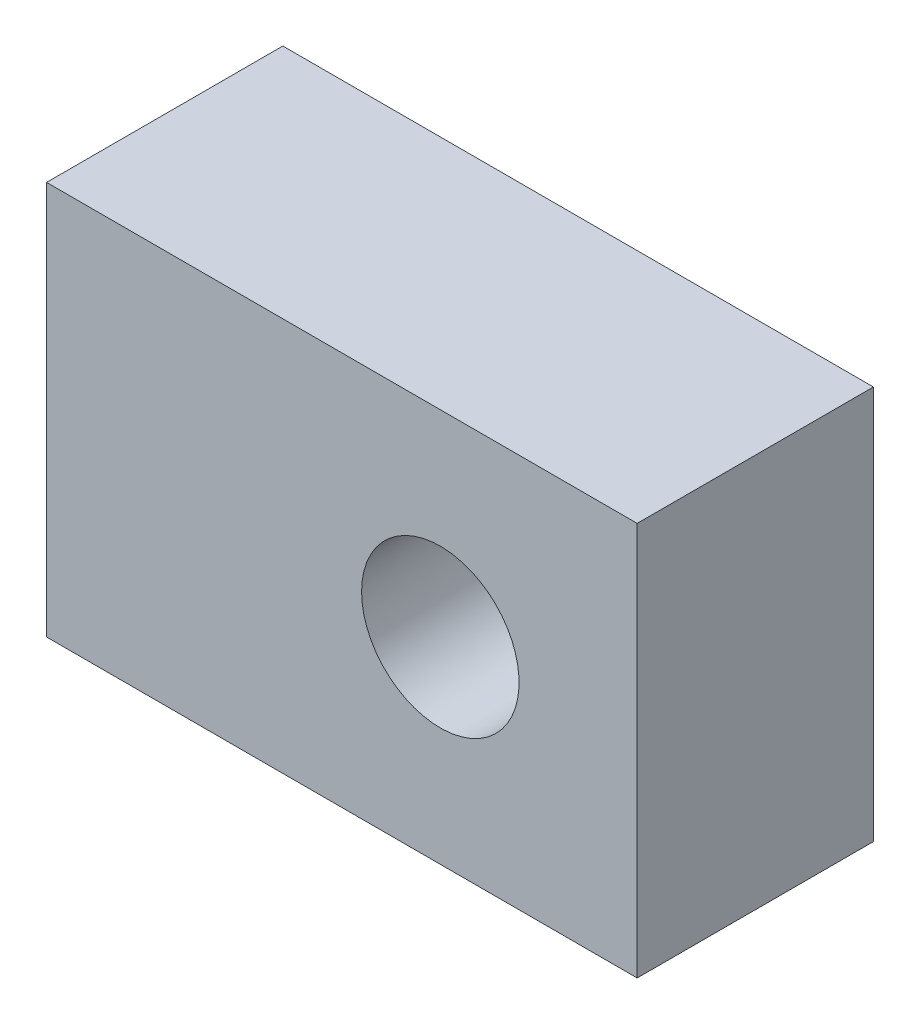
ISO-10303-21;
HEADER;
FILE_DESCRIPTION(('STEP AP214'),'2;1');
FILE_NAME('part.step','',(''),(''),'','','');
FILE_SCHEMA(('AUTOMOTIVE_DESIGN { 1 0 10303 214 1 1 1 1 }'));
ENDSEC;
DATA;
#1=APPLICATION_CONTEXT('core data for automotive mechanical design processes');
#2=APPLICATION_PROTOCOL_DEFINITION('international standard','automotive_design',2000,#1);
#3=PRODUCT_CONTEXT('',#1,'mechanical');
#4=PRODUCT('Part','Part','',(#3));
#5=PRODUCT_RELATED_PRODUCT_CATEGORY('part','',(#4));
#6=PRODUCT_DEFINITION_FORMATION('','',#4);
#7=PRODUCT_DEFINITION_CONTEXT('part definition',#1,'design');
#8=PRODUCT_DEFINITION('design','',#6,#7);
#9=PRODUCT_DEFINITION_SHAPE('','',#8);
#10=(LENGTH_UNIT() NAMED_UNIT(*) SI_UNIT(.MILLI.,.METRE.));
#11=(NAMED_UNIT(*) PLANE_ANGLE_UNIT() SI_UNIT($,.RADIAN.));
#12=(NAMED_UNIT(*) SI_UNIT($,.STERADIAN.) SOLID_ANGLE_UNIT());
#13=UNCERTAINTY_MEASURE_WITH_UNIT(LENGTH_MEASURE(1.E-05),#10,'distance_accuracy_value','');
#14=(GEOMETRIC_REPRESENTATION_CONTEXT(3) GLOBAL_UNCERTAINTY_ASSIGNED_CONTEXT((#13)) GLOBAL_UNIT_ASSIGNED_CONTEXT((#10,
#11,#12)) REPRESENTATION_CONTEXT('',''));
#15=CARTESIAN_POINT('',(0.,0.,0.));
#16=DIRECTION('',(0.,0.,1.));
#17=DIRECTION('',(1.,0.,0.));
#18=AXIS2_PLACEMENT_3D('',#15,#16,#17);
#19=CARTESIAN_POINT('',(0.,0.,6.));
#20=DIRECTION('',(1.,0.,0.));
#21=DIRECTION('',(0.,0.,-1.));
#22=AXIS2_PLACEMENT_3D('',#19,#20,#21);
#23=PLANE('',#22);
#24=DIRECTION('',(0.,-1.,0.));
#25=VECTOR('',#24,1.);
#26=CARTESIAN_POINT('',(0.,0.,0.));
#27=LINE('',#26,#25);
#28=CARTESIAN_POINT('',(0.,10.,0.));
#29=VERTEX_POINT('',#28);
#30=CARTESIAN_POINT('',(0.,0.,0.));
#31=VERTEX_POINT('',#30);
#32=EDGE_CURVE('E106',#29,#31,#27,.T.);
#33=ORIENTED_EDGE('',*,*,#32,.T.);
#34=DIRECTION('',(0.,0.,-1.));
#35=VECTOR('',#34,1.);
#36=CARTESIAN_POINT('',(0.,0.,6.));
#37=LINE('',#36,#35);
#38=CARTESIAN_POINT('',(0.,0.,6.));
#39=VERTEX_POINT('',#38);
#40=EDGE_CURVE('E11',#39,#31,#37,.T.);
#41=ORIENTED_EDGE('',*,*,#40,.F.);
#42=DIRECTION('',(0.,-1.,0.));
#43=VECTOR('',#42,1.);
#44=CARTESIAN_POINT('',(0.,0.,6.));
#45=LINE('',#44,#43);
#46=CARTESIAN_POINT('',(0.,10.,6.));
#47=VERTEX_POINT('',#46);
#48=EDGE_CURVE('E90',#47,#39,#45,.T.);
#49=ORIENTED_EDGE('',*,*,#48,.F.);
#50=DIRECTION('',(0.,0.,-1.));
#51=VECTOR('',#50,1.);
#52=CARTESIAN_POINT('',(0.,10.,6.));
#53=LINE('',#52,#51);
#54=EDGE_CURVE('E102',#47,#29,#53,.T.);
#55=ORIENTED_EDGE('',*,*,#54,.T.);
#56=EDGE_LOOP('',(#33,#41,#49,#55));
#57=FACE_BOUND('',#56,.T.);
#58=ADVANCED_FACE('F38',(#57),#23,.F.);
#59=CARTESIAN_POINT('',(0.,0.,6.));
#60=DIRECTION('',(0.,1.,0.));
#61=DIRECTION('',(0.,0.,1.));
#62=AXIS2_PLACEMENT_3D('',#59,#60,#61);
#63=PLANE('',#62);
#64=DIRECTION('',(1.,0.,0.));
#65=VECTOR('',#64,1.);
#66=CARTESIAN_POINT('',(0.,0.,0.));
#67=LINE('',#66,#65);
#68=CARTESIAN_POINT('',(15.,0.,0.));
#69=VERTEX_POINT('',#68);
#70=EDGE_CURVE('E95',#31,#69,#67,.T.);
#71=ORIENTED_EDGE('',*,*,#70,.T.);
#72=DIRECTION('',(0.,0.,-1.));
#73=VECTOR('',#72,1.);
#74=CARTESIAN_POINT('',(15.,0.,6.));
#75=LINE('',#74,#73);
#76=CARTESIAN_POINT('',(15.,0.,6.));
#77=VERTEX_POINT('',#76);
#78=EDGE_CURVE('E47',#77,#69,#75,.T.);
#79=ORIENTED_EDGE('',*,*,#78,.F.);
#80=DIRECTION('',(1.,0.,0.));
#81=VECTOR('',#80,1.);
#82=CARTESIAN_POINT('',(0.,0.,6.));
#83=LINE('',#82,#81);
#84=EDGE_CURVE('E85',#39,#77,#83,.T.);
#85=ORIENTED_EDGE('',*,*,#84,.F.);
#86=ORIENTED_EDGE('',*,*,#40,.T.);
#87=EDGE_LOOP('',(#71,#79,#85,#86));
#88=FACE_BOUND('',#87,.T.);
#89=ADVANCED_FACE('F94',(#88),#63,.F.);
#90=CARTESIAN_POINT('',(15.,0.,6.));
#91=DIRECTION('',(-1.,0.,0.));
#92=DIRECTION('',(0.,0.,1.));
#93=AXIS2_PLACEMENT_3D('',#90,#91,#92);
#94=PLANE('',#93);
#95=DIRECTION('',(0.,1.,0.));
#96=VECTOR('',#95,1.);
#97=CARTESIAN_POINT('',(15.,0.,0.));
#98=LINE('',#97,#96);
#99=CARTESIAN_POINT('',(15.,10.,0.));
#100=VERTEX_POINT('',#99);
#101=EDGE_CURVE('E72',#69,#100,#98,.T.);
#102=ORIENTED_EDGE('',*,*,#101,.T.);
#103=DIRECTION('',(0.,0.,-1.));
#104=VECTOR('',#103,1.);
#105=CARTESIAN_POINT('',(15.,10.,6.));
#106=LINE('',#105,#104);
#107=CARTESIAN_POINT('',(15.,10.,6.));
#108=VERTEX_POINT('',#107);
#109=EDGE_CURVE('E97',#108,#100,#106,.T.);
#110=ORIENTED_EDGE('',*,*,#109,.F.);
#111=DIRECTION('',(0.,1.,0.));
#112=VECTOR('',#111,1.);
#113=CARTESIAN_POINT('',(15.,0.,6.));
#114=LINE('',#113,#112);
#115=EDGE_CURVE('E88',#77,#108,#114,.T.);
#116=ORIENTED_EDGE('',*,*,#115,.F.);
#117=ORIENTED_EDGE('',*,*,#78,.T.);
#118=EDGE_LOOP('',(#102,#110,#116,#117));
#119=FACE_BOUND('',#118,.T.);
#120=ADVANCED_FACE('F98',(#119),#94,.F.);
#121=CARTESIAN_POINT('',(0.,10.,6.));
#122=DIRECTION('',(0.,-1.,0.));
#123=DIRECTION('',(0.,0.,-1.));
#124=AXIS2_PLACEMENT_3D('',#121,#122,#123);
#125=PLANE('',#124);
#126=DIRECTION('',(-1.,0.,0.));
#127=VECTOR('',#126,1.);
#128=CARTESIAN_POINT('',(0.,10.,0.));
#129=LINE('',#128,#127);
#130=EDGE_CURVE('E78',#100,#29,#129,.T.);
#131=ORIENTED_EDGE('',*,*,#130,.T.);
#132=ORIENTED_EDGE('',*,*,#54,.F.);
#133=DIRECTION('',(-1.,0.,0.));
#134=VECTOR('',#133,1.);
#135=CARTESIAN_POINT('',(0.,10.,6.));
#136=LINE('',#135,#134);
#137=EDGE_CURVE('E55',#108,#47,#136,.T.);
#138=ORIENTED_EDGE('',*,*,#137,.F.);
#139=ORIENTED_EDGE('',*,*,#109,.T.);
#140=EDGE_LOOP('',(#131,#132,#138,#139));
#141=FACE_BOUND('',#140,.T.);
#142=ADVANCED_FACE('F120',(#141),#125,.F.);
#143=CARTESIAN_POINT('',(0.,0.,6.));
#144=DIRECTION('',(0.,0.,-1.));
#145=DIRECTION('',(-1.,0.,0.));
#146=AXIS2_PLACEMENT_3D('',#143,#144,#145);
#147=PLANE('',#146);
#148=CARTESIAN_POINT('',(10.,5.,6.));
#149=DIRECTION('',(0.,0.,-1.));
#150=DIRECTION('',(-1.,0.,0.));
#151=AXIS2_PLACEMENT_3D('',#148,#149,#150);
#152=CIRCLE('',#151,2.);
#153=CARTESIAN_POINT('',(8.,5.,6.));
#154=VERTEX_POINT('',#153);
#155=EDGE_CURVE('E110',#154,#154,#152,.T.);
#156=ORIENTED_EDGE('',*,*,#155,.T.);
#157=EDGE_LOOP('',(#156));
#158=FACE_BOUND('',#157,.T.);
#159=ORIENTED_EDGE('',*,*,#48,.T.);
#160=ORIENTED_EDGE('',*,*,#84,.T.);
#161=ORIENTED_EDGE('',*,*,#115,.T.);
#162=ORIENTED_EDGE('',*,*,#137,.T.);
#163=EDGE_LOOP('',(#159,#160,#161,#162));
#164=FACE_BOUND('',#163,.T.);
#165=ADVANCED_FACE('F86',(#158,#164),#147,.F.);
#166=CARTESIAN_POINT('',(0.,0.,0.));
#167=DIRECTION('',(0.,0.,-1.));
#168=DIRECTION('',(-1.,0.,0.));
#169=AXIS2_PLACEMENT_3D('',#166,#167,#168);
#170=PLANE('',#169);
#171=CARTESIAN_POINT('',(10.,5.,0.));
#172=DIRECTION('',(0.,0.,-1.));
#173=DIRECTION('',(-1.,0.,0.));
#174=AXIS2_PLACEMENT_3D('',#171,#172,#173);
#175=CIRCLE('',#174,2.);
#176=CARTESIAN_POINT('',(8.,5.,0.));
#177=VERTEX_POINT('',#176);
#178=EDGE_CURVE('E127',#177,#177,#175,.T.);
#179=ORIENTED_EDGE('',*,*,#178,.F.);
#180=EDGE_LOOP('',(#179));
#181=FACE_BOUND('',#180,.T.);
#182=ORIENTED_EDGE('',*,*,#32,.F.);
#183=ORIENTED_EDGE('',*,*,#130,.F.);
#184=ORIENTED_EDGE('',*,*,#101,.F.);
#185=ORIENTED_EDGE('',*,*,#70,.F.);
#186=EDGE_LOOP('',(#182,#183,#184,#185));
#187=FACE_BOUND('',#186,.T.);
#188=ADVANCED_FACE('F123',(#181,#187),#170,.T.);
#189=CARTESIAN_POINT('',(10.,5.,6.));
#190=DIRECTION('',(0.,0.,-1.));
#191=DIRECTION('',(-1.,0.,0.));
#192=AXIS2_PLACEMENT_3D('',#189,#190,#191);
#193=CYLINDRICAL_SURFACE('',#192,2.);
#194=ORIENTED_EDGE('',*,*,#155,.F.);
#195=EDGE_LOOP('',(#194));
#196=FACE_BOUND('',#195,.T.);
#197=ORIENTED_EDGE('',*,*,#178,.T.);
#198=EDGE_LOOP('',(#197));
#199=FACE_BOUND('',#198,.T.);
#200=ADVANCED_FACE('F136',(#196,#199),#193,.F.);
#201=CLOSED_SHELL('',(#58,#89,#120,#142,#165,#188,#200));
#202=MANIFOLD_SOLID_BREP('B2',#201);
#203=ADVANCED_BREP_SHAPE_REPRESENTATION('',(#18,#202),#14);
#204=SHAPE_DEFINITION_REPRESENTATION(#9,#203);
ENDSEC;
END-ISO-10303-21;
